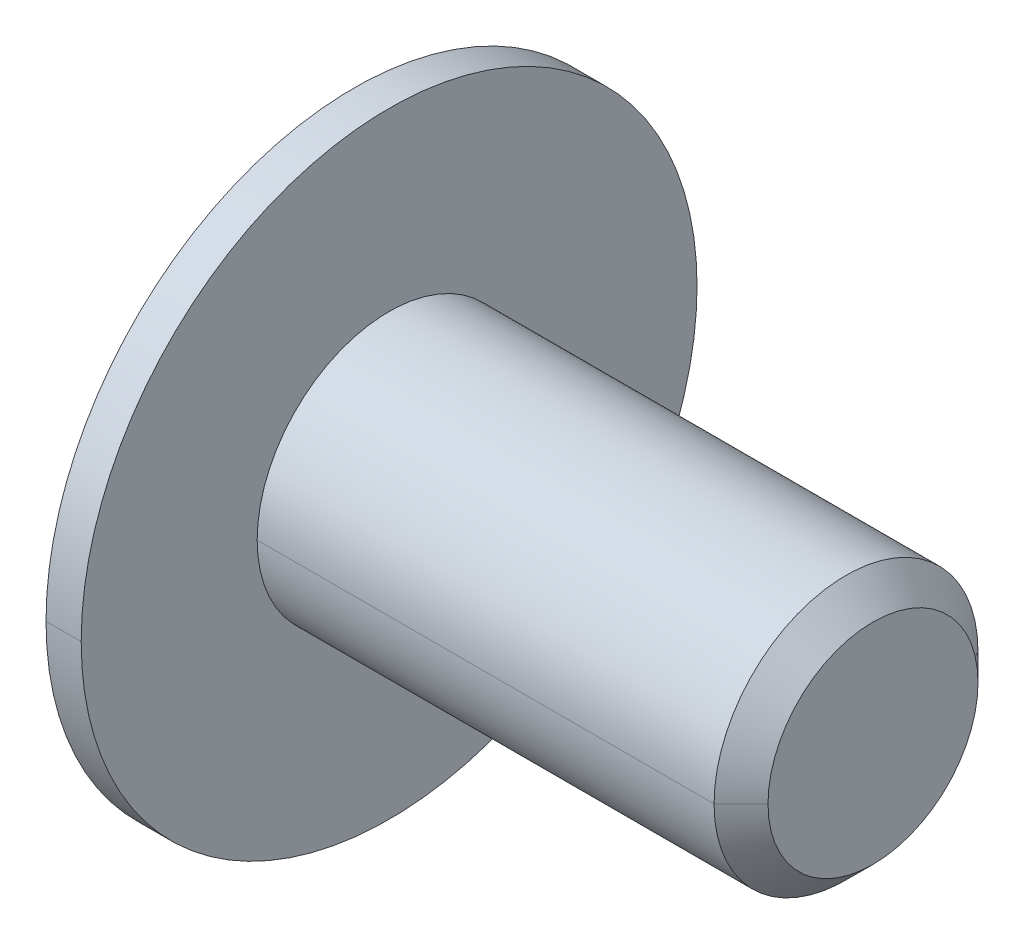
ISO-10303-21;
HEADER;
FILE_DESCRIPTION(('STEP AP214'),'2;1');
FILE_NAME('part.step','',(''),(''),'','','');
FILE_SCHEMA(('AUTOMOTIVE_DESIGN { 1 0 10303 214 1 1 1 1 }'));
ENDSEC;
DATA;
#1=APPLICATION_CONTEXT('core data for automotive mechanical design processes');
#2=APPLICATION_PROTOCOL_DEFINITION('international standard','automotive_design',2000,#1);
#3=PRODUCT_CONTEXT('',#1,'mechanical');
#4=PRODUCT('Part','Part','',(#3));
#5=PRODUCT_RELATED_PRODUCT_CATEGORY('part','',(#4));
#6=PRODUCT_DEFINITION_FORMATION('','',#4);
#7=PRODUCT_DEFINITION_CONTEXT('part definition',#1,'design');
#8=PRODUCT_DEFINITION('design','',#6,#7);
#9=PRODUCT_DEFINITION_SHAPE('','',#8);
#10=(LENGTH_UNIT() NAMED_UNIT(*) SI_UNIT(.MILLI.,.METRE.));
#11=(NAMED_UNIT(*) PLANE_ANGLE_UNIT() SI_UNIT($,.RADIAN.));
#12=(NAMED_UNIT(*) SI_UNIT($,.STERADIAN.) SOLID_ANGLE_UNIT());
#13=UNCERTAINTY_MEASURE_WITH_UNIT(LENGTH_MEASURE(1.E-05),#10,'distance_accuracy_value','');
#14=(GEOMETRIC_REPRESENTATION_CONTEXT(3) GLOBAL_UNCERTAINTY_ASSIGNED_CONTEXT((#13)) GLOBAL_UNIT_ASSIGNED_CONTEXT((#10,
#11,#12)) REPRESENTATION_CONTEXT('',''));
#15=CARTESIAN_POINT('',(0.,0.,0.));
#16=DIRECTION('',(0.,0.,1.));
#17=DIRECTION('',(1.,0.,0.));
#18=AXIS2_PLACEMENT_3D('',#15,#16,#17);
#19=CARTESIAN_POINT('',(-0.05,0.721070929376451,0.753098152207589));
#20=DIRECTION('',(1.,0.,0.));
#21=DIRECTION('',(0.,1.,0.));
#22=AXIS2_PLACEMENT_3D('',#19,#20,#21);
#23=PLANE('',#22);
#24=CARTESIAN_POINT('',(-0.05,0.583333333333333,1.01036297108185));
#25=DIRECTION('',(1.,0.,0.));
#26=DIRECTION('',(0.,0.,-1.));
#27=AXIS2_PLACEMENT_3D('',#24,#25,#26);
#28=CIRCLE('',#27,0.4117647059);
#29=CARTESIAN_POINT('',(-0.05,0.173596498582184,0.969547541909899));
#30=VERTEX_POINT('',#29);
#31=CARTESIAN_POINT('',(-0.05,0.752854552179633,0.635112748735148));
#32=VERTEX_POINT('',#31);
#33=EDGE_CURVE('E352',#30,#32,#28,.T.);
#34=ORIENTED_EDGE('',*,*,#33,.T.);
#35=CARTESIAN_POINT('',(-0.05,0.858808525419568,0.495833333333334));
#36=DIRECTION('',(1.,0.,0.));
#37=DIRECTION('',(0.,0.,-1.));
#38=AXIS2_PLACEMENT_3D('',#35,#36,#37);
#39=CIRCLE('',#38,0.175);
#40=CARTESIAN_POINT('',(-0.05,0.858808525419568,0.670833333333334));
#41=VERTEX_POINT('',#40);
#42=EDGE_CURVE('E333',#41,#32,#39,.T.);
#43=ORIENTED_EDGE('',*,*,#42,.F.);
#44=CARTESIAN_POINT('',(-0.05,0.858808525419568,0.495833333333334));
#45=DIRECTION('',(1.,0.,0.));
#46=DIRECTION('',(0.,0.,-1.));
#47=AXIS2_PLACEMENT_3D('',#44,#45,#46);
#48=CIRCLE('',#47,0.175);
#49=CARTESIAN_POINT('',(-0.05,0.926451050761822,0.334434793174749));
#50=VERTEX_POINT('',#49);
#51=EDGE_CURVE('E262',#50,#41,#48,.T.);
#52=ORIENTED_EDGE('',*,*,#51,.F.);
#53=CARTESIAN_POINT('',(-0.05,1.16666666666667,0.));
#54=DIRECTION('',(1.,0.,0.));
#55=DIRECTION('',(0.,0.,-1.));
#56=AXIS2_PLACEMENT_3D('',#53,#54,#55);
#57=CIRCLE('',#56,0.4117647059);
#58=CARTESIAN_POINT('',(-0.05,0.926451050761818,-0.334434793174745));
#59=VERTEX_POINT('',#58);
#60=EDGE_CURVE('E312',#50,#59,#57,.T.);
#61=ORIENTED_EDGE('',*,*,#60,.T.);
#62=CARTESIAN_POINT('',(-0.05,0.858808525419569,-0.495833333333333));
#63=DIRECTION('',(1.,0.,0.));
#64=DIRECTION('',(0.,0.,-1.));
#65=AXIS2_PLACEMENT_3D('',#62,#63,#64);
#66=CIRCLE('',#65,0.175);
#67=CARTESIAN_POINT('',(-0.05,0.75285455217964,-0.635112748735152));
#68=VERTEX_POINT('',#67);
#69=EDGE_CURVE('E316',#68,#59,#66,.T.);
#70=ORIENTED_EDGE('',*,*,#69,.F.);
#71=CARTESIAN_POINT('',(-0.05,0.583333333333333,-1.01036297108185));
#72=DIRECTION('',(1.,0.,0.));
#73=DIRECTION('',(0.,0.,-1.));
#74=AXIS2_PLACEMENT_3D('',#71,#72,#73);
#75=CIRCLE('',#74,0.4117647059);
#76=CARTESIAN_POINT('',(-0.05,0.583333333333333,-0.59859826518185));
#77=VERTEX_POINT('',#76);
#78=EDGE_CURVE('E244',#68,#77,#75,.T.);
#79=ORIENTED_EDGE('',*,*,#78,.T.);
#80=CARTESIAN_POINT('',(-0.05,0.583333333333333,-1.01036297108185));
#81=DIRECTION('',(1.,0.,0.));
#82=DIRECTION('',(0.,0.,-1.));
#83=AXIS2_PLACEMENT_3D('',#80,#81,#82);
#84=CIRCLE('',#83,0.4117647059);
#85=CARTESIAN_POINT('',(-0.05,0.173596498582185,-0.969547541909895));
#86=VERTEX_POINT('',#85);
#87=EDGE_CURVE('E278',#77,#86,#84,.T.);
#88=ORIENTED_EDGE('',*,*,#87,.T.);
#89=CARTESIAN_POINT('',(-0.05,0.,-0.991666666666667));
#90=DIRECTION('',(1.,0.,0.));
#91=DIRECTION('',(0.,0.,-1.));
#92=AXIS2_PLACEMENT_3D('',#89,#90,#91);
#93=CIRCLE('',#92,0.175);
#94=CARTESIAN_POINT('',(-0.05,-0.173596498582185,-0.969547541909899));
#95=VERTEX_POINT('',#94);
#96=EDGE_CURVE('E282',#95,#86,#93,.T.);
#97=ORIENTED_EDGE('',*,*,#96,.F.);
#98=CARTESIAN_POINT('',(-0.05,-0.583333333333334,-1.01036297108185));
#99=DIRECTION('',(1.,0.,0.));
#100=DIRECTION('',(0.,0.,-1.));
#101=AXIS2_PLACEMENT_3D('',#98,#99,#100);
#102=CIRCLE('',#101,0.4117647059);
#103=CARTESIAN_POINT('',(-0.05,-0.583333333333334,-0.59859826518185));
#104=VERTEX_POINT('',#103);
#105=EDGE_CURVE('E299',#95,#104,#102,.T.);
#106=ORIENTED_EDGE('',*,*,#105,.T.);
#107=CARTESIAN_POINT('',(-0.05,-0.583333333333334,-1.01036297108185));
#108=DIRECTION('',(1.,0.,0.));
#109=DIRECTION('',(0.,0.,-1.));
#110=AXIS2_PLACEMENT_3D('',#107,#108,#109);
#111=CIRCLE('',#110,0.4117647059);
#112=CARTESIAN_POINT('',(-0.05,-0.752854552179634,-0.635112748735148));
#113=VERTEX_POINT('',#112);
#114=EDGE_CURVE('E319',#104,#113,#111,.T.);
#115=ORIENTED_EDGE('',*,*,#114,.T.);
#116=CARTESIAN_POINT('',(-0.05,-0.858808525419567,-0.495833333333333));
#117=DIRECTION('',(1.,0.,0.));
#118=DIRECTION('',(0.,0.,-1.));
#119=AXIS2_PLACEMENT_3D('',#116,#117,#118);
#120=CIRCLE('',#119,0.175);
#121=CARTESIAN_POINT('',(-0.05,-0.926451050761821,-0.334434793174747));
#122=VERTEX_POINT('',#121);
#123=EDGE_CURVE('E372',#122,#113,#120,.T.);
#124=ORIENTED_EDGE('',*,*,#123,.F.);
#125=CARTESIAN_POINT('',(-0.05,-1.16666666666667,0.));
#126=DIRECTION('',(1.,0.,0.));
#127=DIRECTION('',(0.,0.,-1.));
#128=AXIS2_PLACEMENT_3D('',#125,#126,#127);
#129=CIRCLE('',#128,0.4117647059);
#130=CARTESIAN_POINT('',(-0.05,-0.926451050761819,0.334434793174746));
#131=VERTEX_POINT('',#130);
#132=EDGE_CURVE('E288',#122,#131,#129,.T.);
#133=ORIENTED_EDGE('',*,*,#132,.T.);
#134=CARTESIAN_POINT('',(-0.05,-0.858808525419569,0.495833333333333));
#135=DIRECTION('',(1.,0.,0.));
#136=DIRECTION('',(0.,0.,-1.));
#137=AXIS2_PLACEMENT_3D('',#134,#135,#136);
#138=CIRCLE('',#137,0.175);
#139=CARTESIAN_POINT('',(-0.05,-0.858808525419569,0.670833333333333));
#140=VERTEX_POINT('',#139);
#141=EDGE_CURVE('E272',#140,#131,#138,.T.);
#142=ORIENTED_EDGE('',*,*,#141,.F.);
#143=CARTESIAN_POINT('',(-0.05,-0.858808525419569,0.495833333333333));
#144=DIRECTION('',(1.,0.,0.));
#145=DIRECTION('',(0.,0.,-1.));
#146=AXIS2_PLACEMENT_3D('',#143,#144,#145);
#147=CIRCLE('',#146,0.175);
#148=CARTESIAN_POINT('',(-0.05,-0.752854552179638,0.63511274873515));
#149=VERTEX_POINT('',#148);
#150=EDGE_CURVE('E287',#149,#140,#147,.T.);
#151=ORIENTED_EDGE('',*,*,#150,.F.);
#152=CARTESIAN_POINT('',(-0.05,-0.583333333333333,1.01036297108185));
#153=DIRECTION('',(1.,0.,0.));
#154=DIRECTION('',(0.,0.,-1.));
#155=AXIS2_PLACEMENT_3D('',#152,#153,#154);
#156=CIRCLE('',#155,0.4117647059);
#157=CARTESIAN_POINT('',(-0.05,-0.173596498582185,0.969547541909894));
#158=VERTEX_POINT('',#157);
#159=EDGE_CURVE('E27',#149,#158,#156,.T.);
#160=ORIENTED_EDGE('',*,*,#159,.T.);
#161=CARTESIAN_POINT('',(-0.05,0.,0.991666666666667));
#162=DIRECTION('',(1.,0.,0.));
#163=DIRECTION('',(0.,0.,-1.));
#164=AXIS2_PLACEMENT_3D('',#161,#162,#163);
#165=CIRCLE('',#164,0.175);
#166=CARTESIAN_POINT('',(-0.05,0.,1.16666666666667));
#167=VERTEX_POINT('',#166);
#168=EDGE_CURVE('E293',#167,#158,#165,.T.);
#169=ORIENTED_EDGE('',*,*,#168,.F.);
#170=CARTESIAN_POINT('',(-0.05,0.,0.991666666666667));
#171=DIRECTION('',(1.,0.,0.));
#172=DIRECTION('',(0.,0.,-1.));
#173=AXIS2_PLACEMENT_3D('',#170,#171,#172);
#174=CIRCLE('',#173,0.175);
#175=EDGE_CURVE('E10',#30,#167,#174,.T.);
#176=ORIENTED_EDGE('',*,*,#175,.F.);
#177=EDGE_LOOP('',(#34,#43,#52,#61,#70,#79,#88,#97,#106,#115,#124,#133,#142,#151,#160,#169,#176));
#178=FACE_BOUND('',#177,.T.);
#179=ADVANCED_FACE('F16',(#178),#23,.F.);
#180=CARTESIAN_POINT('',(-0.05,0.,0.991666666666667));
#181=DIRECTION('',(1.,0.,0.));
#182=DIRECTION('',(0.,0.,1.));
#183=AXIS2_PLACEMENT_3D('',#180,#181,#182);
#184=CYLINDRICAL_SURFACE('',#183,0.175);
#185=DIRECTION('',(1.,0.,0.));
#186=VECTOR('',#185,1.);
#187=CARTESIAN_POINT('',(-0.05,0.,1.16666666666667));
#188=LINE('',#187,#186);
#189=CARTESIAN_POINT('',(-0.8,0.,1.16666666666667));
#190=VERTEX_POINT('',#189);
#191=EDGE_CURVE('E289',#190,#167,#188,.T.);
#192=ORIENTED_EDGE('',*,*,#191,.F.);
#193=CARTESIAN_POINT('',(-0.8,0.,0.991666666666667));
#194=DIRECTION('',(1.,0.,0.));
#195=DIRECTION('',(0.,0.,-1.));
#196=AXIS2_PLACEMENT_3D('',#193,#194,#195);
#197=CIRCLE('',#196,0.175);
#198=CARTESIAN_POINT('',(-0.8,0.173596498582184,0.969547541909899));
#199=VERTEX_POINT('',#198);
#200=EDGE_CURVE('E257',#199,#190,#197,.T.);
#201=ORIENTED_EDGE('',*,*,#200,.F.);
#202=DIRECTION('',(-1.,0.,0.));
#203=VECTOR('',#202,1.);
#204=CARTESIAN_POINT('',(-0.05,0.173596498582184,0.969547541909899));
#205=LINE('',#204,#203);
#206=EDGE_CURVE('E349',#30,#199,#205,.T.);
#207=ORIENTED_EDGE('',*,*,#206,.F.);
#208=ORIENTED_EDGE('',*,*,#175,.T.);
#209=EDGE_LOOP('',(#192,#201,#207,#208));
#210=FACE_BOUND('',#209,.T.);
#211=ADVANCED_FACE('F732',(#210),#184,.F.);
#212=CARTESIAN_POINT('',(-0.05,-0.583333333333333,1.01036297108185));
#213=DIRECTION('',(1.,0.,0.));
#214=DIRECTION('',(0.,0.,1.));
#215=AXIS2_PLACEMENT_3D('',#212,#213,#214);
#216=CYLINDRICAL_SURFACE('',#215,0.4117647059);
#217=CARTESIAN_POINT('',(-0.8,-0.583333333333333,1.01036297108185));
#218=DIRECTION('',(1.,0.,0.));
#219=DIRECTION('',(0.,0.,-1.));
#220=AXIS2_PLACEMENT_3D('',#217,#218,#219);
#221=CIRCLE('',#220,0.4117647059);
#222=CARTESIAN_POINT('',(-0.8,-0.752854552179638,0.63511274873515));
#223=VERTEX_POINT('',#222);
#224=CARTESIAN_POINT('',(-0.8,-0.173596498582185,0.969547541909894));
#225=VERTEX_POINT('',#224);
#226=EDGE_CURVE('E261',#223,#225,#221,.T.);
#227=ORIENTED_EDGE('',*,*,#226,.T.);
#228=DIRECTION('',(-1.,0.,0.));
#229=VECTOR('',#228,1.);
#230=CARTESIAN_POINT('',(-0.05,-0.173596498582185,0.969547541909894));
#231=LINE('',#230,#229);
#232=EDGE_CURVE('E311',#158,#225,#231,.T.);
#233=ORIENTED_EDGE('',*,*,#232,.F.);
#234=ORIENTED_EDGE('',*,*,#159,.F.);
#235=DIRECTION('',(-1.,0.,0.));
#236=VECTOR('',#235,1.);
#237=CARTESIAN_POINT('',(-0.05,-0.752854552179638,0.63511274873515));
#238=LINE('',#237,#236);
#239=EDGE_CURVE('E284',#149,#223,#238,.T.);
#240=ORIENTED_EDGE('',*,*,#239,.T.);
#241=EDGE_LOOP('',(#227,#233,#234,#240));
#242=FACE_BOUND('',#241,.T.);
#243=ADVANCED_FACE('F18',(#242),#216,.T.);
#244=CARTESIAN_POINT('',(-0.05,-0.858808525419569,0.495833333333333));
#245=DIRECTION('',(1.,0.,0.));
#246=DIRECTION('',(0.,0.,1.));
#247=AXIS2_PLACEMENT_3D('',#244,#245,#246);
#248=CYLINDRICAL_SURFACE('',#247,0.175);
#249=DIRECTION('',(1.,0.,0.));
#250=VECTOR('',#249,1.);
#251=CARTESIAN_POINT('',(-0.05,-0.858808525419569,0.670833333333333));
#252=LINE('',#251,#250);
#253=CARTESIAN_POINT('',(-0.8,-0.858808525419569,0.670833333333333));
#254=VERTEX_POINT('',#253);
#255=EDGE_CURVE('E356',#254,#140,#252,.T.);
#256=ORIENTED_EDGE('',*,*,#255,.F.);
#257=CARTESIAN_POINT('',(-0.8,-0.858808525419569,0.495833333333333));
#258=DIRECTION('',(1.,0.,0.));
#259=DIRECTION('',(0.,0.,-1.));
#260=AXIS2_PLACEMENT_3D('',#257,#258,#259);
#261=CIRCLE('',#260,0.175);
#262=EDGE_CURVE('E277',#223,#254,#261,.T.);
#263=ORIENTED_EDGE('',*,*,#262,.F.);
#264=ORIENTED_EDGE('',*,*,#239,.F.);
#265=ORIENTED_EDGE('',*,*,#150,.T.);
#266=EDGE_LOOP('',(#256,#263,#264,#265));
#267=FACE_BOUND('',#266,.T.);
#268=ADVANCED_FACE('F762',(#267),#248,.F.);
#269=CARTESIAN_POINT('',(-0.05,-1.16666666666667,0.));
#270=DIRECTION('',(1.,0.,0.));
#271=DIRECTION('',(0.,0.,1.));
#272=AXIS2_PLACEMENT_3D('',#269,#270,#271);
#273=CYLINDRICAL_SURFACE('',#272,0.4117647059);
#274=CARTESIAN_POINT('',(-0.8,-1.16666666666667,0.));
#275=DIRECTION('',(1.,0.,0.));
#276=DIRECTION('',(0.,0.,-1.));
#277=AXIS2_PLACEMENT_3D('',#274,#275,#276);
#278=CIRCLE('',#277,0.4117647059);
#279=CARTESIAN_POINT('',(-0.8,-0.926451050761821,-0.334434793174747));
#280=VERTEX_POINT('',#279);
#281=CARTESIAN_POINT('',(-0.8,-0.926451050761819,0.334434793174746));
#282=VERTEX_POINT('',#281);
#283=EDGE_CURVE('E273',#280,#282,#278,.T.);
#284=ORIENTED_EDGE('',*,*,#283,.T.);
#285=DIRECTION('',(-1.,0.,0.));
#286=VECTOR('',#285,1.);
#287=CARTESIAN_POINT('',(-0.05,-0.926451050761819,0.334434793174746));
#288=LINE('',#287,#286);
#289=EDGE_CURVE('E267',#131,#282,#288,.T.);
#290=ORIENTED_EDGE('',*,*,#289,.F.);
#291=ORIENTED_EDGE('',*,*,#132,.F.);
#292=DIRECTION('',(-1.,0.,0.));
#293=VECTOR('',#292,1.);
#294=CARTESIAN_POINT('',(-0.05,-0.926451050761821,-0.334434793174747));
#295=LINE('',#294,#293);
#296=EDGE_CURVE('E323',#122,#280,#295,.T.);
#297=ORIENTED_EDGE('',*,*,#296,.T.);
#298=EDGE_LOOP('',(#284,#290,#291,#297));
#299=FACE_BOUND('',#298,.T.);
#300=ADVANCED_FACE('F464',(#299),#273,.T.);
#301=CARTESIAN_POINT('',(-0.05,-0.858808525419567,-0.495833333333333));
#302=DIRECTION('',(1.,0.,0.));
#303=DIRECTION('',(0.,0.,1.));
#304=AXIS2_PLACEMENT_3D('',#301,#302,#303);
#305=CYLINDRICAL_SURFACE('',#304,0.175);
#306=CARTESIAN_POINT('',(-0.8,-0.858808525419567,-0.495833333333333));
#307=DIRECTION('',(1.,0.,0.));
#308=DIRECTION('',(0.,0.,-1.));
#309=AXIS2_PLACEMENT_3D('',#306,#307,#308);
#310=CIRCLE('',#309,0.175);
#311=CARTESIAN_POINT('',(-0.8,-0.752854552179634,-0.635112748735148));
#312=VERTEX_POINT('',#311);
#313=EDGE_CURVE('E276',#280,#312,#310,.T.);
#314=ORIENTED_EDGE('',*,*,#313,.F.);
#315=ORIENTED_EDGE('',*,*,#296,.F.);
#316=ORIENTED_EDGE('',*,*,#123,.T.);
#317=DIRECTION('',(-1.,0.,0.));
#318=VECTOR('',#317,1.);
#319=CARTESIAN_POINT('',(-0.05,-0.752854552179634,-0.635112748735148));
#320=LINE('',#319,#318);
#321=EDGE_CURVE('E20',#113,#312,#320,.T.);
#322=ORIENTED_EDGE('',*,*,#321,.T.);
#323=EDGE_LOOP('',(#314,#315,#316,#322));
#324=FACE_BOUND('',#323,.T.);
#325=ADVANCED_FACE('F451',(#324),#305,.F.);
#326=CARTESIAN_POINT('',(-0.05,-0.583333333333334,-1.01036297108185));
#327=DIRECTION('',(1.,0.,0.));
#328=DIRECTION('',(0.,0.,1.));
#329=AXIS2_PLACEMENT_3D('',#326,#327,#328);
#330=CYLINDRICAL_SURFACE('',#329,0.4117647059);
#331=DIRECTION('',(1.,0.,0.));
#332=VECTOR('',#331,1.);
#333=CARTESIAN_POINT('',(-0.05,-0.583333333333334,-0.59859826518185));
#334=LINE('',#333,#332);
#335=CARTESIAN_POINT('',(-0.8,-0.583333333333334,-0.59859826518185));
#336=VERTEX_POINT('',#335);
#337=EDGE_CURVE('E295',#336,#104,#334,.T.);
#338=ORIENTED_EDGE('',*,*,#337,.F.);
#339=CARTESIAN_POINT('',(-0.8,-0.583333333333334,-1.01036297108185));
#340=DIRECTION('',(1.,0.,0.));
#341=DIRECTION('',(0.,0.,-1.));
#342=AXIS2_PLACEMENT_3D('',#339,#340,#341);
#343=CIRCLE('',#342,0.4117647059);
#344=EDGE_CURVE('E337',#336,#312,#343,.T.);
#345=ORIENTED_EDGE('',*,*,#344,.T.);
#346=ORIENTED_EDGE('',*,*,#321,.F.);
#347=ORIENTED_EDGE('',*,*,#114,.F.);
#348=EDGE_LOOP('',(#338,#345,#346,#347));
#349=FACE_BOUND('',#348,.T.);
#350=ADVANCED_FACE('F458',(#349),#330,.T.);
#351=CARTESIAN_POINT('',(-0.05,0.,-0.991666666666667));
#352=DIRECTION('',(1.,0.,0.));
#353=DIRECTION('',(0.,0.,1.));
#354=AXIS2_PLACEMENT_3D('',#351,#352,#353);
#355=CYLINDRICAL_SURFACE('',#354,0.175);
#356=CARTESIAN_POINT('',(-0.8,0.,-0.991666666666667));
#357=DIRECTION('',(1.,0.,0.));
#358=DIRECTION('',(0.,0.,-1.));
#359=AXIS2_PLACEMENT_3D('',#356,#357,#358);
#360=CIRCLE('',#359,0.175);
#361=CARTESIAN_POINT('',(-0.8,-0.173596498582185,-0.969547541909899));
#362=VERTEX_POINT('',#361);
#363=CARTESIAN_POINT('',(-0.8,0.173596498582185,-0.969547541909895));
#364=VERTEX_POINT('',#363);
#365=EDGE_CURVE('E340',#362,#364,#360,.T.);
#366=ORIENTED_EDGE('',*,*,#365,.F.);
#367=DIRECTION('',(-1.,0.,0.));
#368=VECTOR('',#367,1.);
#369=CARTESIAN_POINT('',(-0.05,-0.173596498582185,-0.969547541909899));
#370=LINE('',#369,#368);
#371=EDGE_CURVE('E345',#95,#362,#370,.T.);
#372=ORIENTED_EDGE('',*,*,#371,.F.);
#373=ORIENTED_EDGE('',*,*,#96,.T.);
#374=DIRECTION('',(-1.,0.,0.));
#375=VECTOR('',#374,1.);
#376=CARTESIAN_POINT('',(-0.05,0.173596498582185,-0.969547541909895));
#377=LINE('',#376,#375);
#378=EDGE_CURVE('E283',#86,#364,#377,.T.);
#379=ORIENTED_EDGE('',*,*,#378,.T.);
#380=EDGE_LOOP('',(#366,#372,#373,#379));
#381=FACE_BOUND('',#380,.T.);
#382=ADVANCED_FACE('F503',(#381),#355,.F.);
#383=CARTESIAN_POINT('',(-0.05,0.583333333333333,-1.01036297108185));
#384=DIRECTION('',(1.,0.,0.));
#385=DIRECTION('',(0.,0.,1.));
#386=AXIS2_PLACEMENT_3D('',#383,#384,#385);
#387=CYLINDRICAL_SURFACE('',#386,0.4117647059);
#388=DIRECTION('',(1.,0.,0.));
#389=VECTOR('',#388,1.);
#390=CARTESIAN_POINT('',(-0.05,0.583333333333333,-0.59859826518185));
#391=LINE('',#390,#389);
#392=CARTESIAN_POINT('',(-0.8,0.583333333333333,-0.59859826518185));
#393=VERTEX_POINT('',#392);
#394=EDGE_CURVE('E300',#393,#77,#391,.T.);
#395=ORIENTED_EDGE('',*,*,#394,.F.);
#396=CARTESIAN_POINT('',(-0.8,0.583333333333333,-1.01036297108185));
#397=DIRECTION('',(1.,0.,0.));
#398=DIRECTION('',(0.,0.,-1.));
#399=AXIS2_PLACEMENT_3D('',#396,#397,#398);
#400=CIRCLE('',#399,0.4117647059);
#401=EDGE_CURVE('E344',#393,#364,#400,.T.);
#402=ORIENTED_EDGE('',*,*,#401,.T.);
#403=ORIENTED_EDGE('',*,*,#378,.F.);
#404=ORIENTED_EDGE('',*,*,#87,.F.);
#405=EDGE_LOOP('',(#395,#402,#403,#404));
#406=FACE_BOUND('',#405,.T.);
#407=ADVANCED_FACE('F502',(#406),#387,.T.);
#408=CARTESIAN_POINT('',(-0.05,0.858808525419569,-0.495833333333333));
#409=DIRECTION('',(1.,0.,0.));
#410=DIRECTION('',(0.,0.,1.));
#411=AXIS2_PLACEMENT_3D('',#408,#409,#410);
#412=CYLINDRICAL_SURFACE('',#411,0.175);
#413=CARTESIAN_POINT('',(-0.8,0.858808525419569,-0.495833333333333));
#414=DIRECTION('',(1.,0.,0.));
#415=DIRECTION('',(0.,0.,-1.));
#416=AXIS2_PLACEMENT_3D('',#413,#414,#415);
#417=CIRCLE('',#416,0.175);
#418=CARTESIAN_POINT('',(-0.8,0.75285455217964,-0.635112748735152));
#419=VERTEX_POINT('',#418);
#420=CARTESIAN_POINT('',(-0.8,0.926451050761818,-0.334434793174745));
#421=VERTEX_POINT('',#420);
#422=EDGE_CURVE('E399',#419,#421,#417,.T.);
#423=ORIENTED_EDGE('',*,*,#422,.F.);
#424=DIRECTION('',(-1.,0.,0.));
#425=VECTOR('',#424,1.);
#426=CARTESIAN_POINT('',(-0.05,0.75285455217964,-0.635112748735152));
#427=LINE('',#426,#425);
#428=EDGE_CURVE('E235',#68,#419,#427,.T.);
#429=ORIENTED_EDGE('',*,*,#428,.F.);
#430=ORIENTED_EDGE('',*,*,#69,.T.);
#431=DIRECTION('',(-1.,0.,0.));
#432=VECTOR('',#431,1.);
#433=CARTESIAN_POINT('',(-0.05,0.926451050761818,-0.334434793174745));
#434=LINE('',#433,#432);
#435=EDGE_CURVE('E175',#59,#421,#434,.T.);
#436=ORIENTED_EDGE('',*,*,#435,.T.);
#437=EDGE_LOOP('',(#423,#429,#430,#436));
#438=FACE_BOUND('',#437,.T.);
#439=ADVANCED_FACE('F484',(#438),#412,.F.);
#440=CARTESIAN_POINT('',(-0.05,1.16666666666667,0.));
#441=DIRECTION('',(1.,0.,0.));
#442=DIRECTION('',(0.,0.,1.));
#443=AXIS2_PLACEMENT_3D('',#440,#441,#442);
#444=CYLINDRICAL_SURFACE('',#443,0.4117647059);
#445=DIRECTION('',(-1.,0.,0.));
#446=VECTOR('',#445,1.);
#447=CARTESIAN_POINT('',(-0.05,0.926451050761822,0.334434793174749));
#448=LINE('',#447,#446);
#449=CARTESIAN_POINT('',(-0.8,0.926451050761822,0.334434793174749));
#450=VERTEX_POINT('',#449);
#451=EDGE_CURVE('E266',#50,#450,#448,.T.);
#452=ORIENTED_EDGE('',*,*,#451,.T.);
#453=CARTESIAN_POINT('',(-0.8,1.16666666666667,0.));
#454=DIRECTION('',(-1.,0.,0.));
#455=DIRECTION('',(0.,0.,-1.));
#456=AXIS2_PLACEMENT_3D('',#453,#454,#455);
#457=CIRCLE('',#456,0.4117647059);
#458=EDGE_CURVE('E395',#421,#450,#457,.T.);
#459=ORIENTED_EDGE('',*,*,#458,.F.);
#460=ORIENTED_EDGE('',*,*,#435,.F.);
#461=ORIENTED_EDGE('',*,*,#60,.F.);
#462=EDGE_LOOP('',(#452,#459,#460,#461));
#463=FACE_BOUND('',#462,.T.);
#464=ADVANCED_FACE('F490',(#463),#444,.T.);
#465=CARTESIAN_POINT('',(-0.8,0.,0.));
#466=DIRECTION('',(1.,0.,0.));
#467=DIRECTION('',(0.,0.,-1.));
#468=AXIS2_PLACEMENT_3D('',#465,#466,#467);
#469=CONICAL_SURFACE('',#468,2.8,1.0516502125);
#470=DIRECTION('',(0.496138938398834,0.,0.868243142100459));
#471=VECTOR('',#470,1.);
#472=CARTESIAN_POINT('',(-0.8,0.,2.8));
#473=LINE('',#472,#471);
#474=CARTESIAN_POINT('',(-0.8,0.,2.8));
#475=VERTEX_POINT('',#474);
#476=CARTESIAN_POINT('',(-0.4,0.,3.5));
#477=VERTEX_POINT('',#476);
#478=EDGE_CURVE('E217',#475,#477,#473,.T.);
#479=ORIENTED_EDGE('',*,*,#478,.F.);
#480=CARTESIAN_POINT('',(-0.8,0.,0.));
#481=DIRECTION('',(1.,0.,0.));
#482=DIRECTION('',(0.,0.,-1.));
#483=AXIS2_PLACEMENT_3D('',#480,#481,#482);
#484=CIRCLE('',#483,2.8);
#485=CARTESIAN_POINT('',(-0.8,0.,-2.8));
#486=VERTEX_POINT('',#485);
#487=EDGE_CURVE('E210',#475,#486,#484,.T.);
#488=ORIENTED_EDGE('',*,*,#487,.T.);
#489=DIRECTION('',(0.496138938398834,0.,-0.868243142100459));
#490=VECTOR('',#489,1.);
#491=CARTESIAN_POINT('',(-0.8,0.,-2.8));
#492=LINE('',#491,#490);
#493=CARTESIAN_POINT('',(-0.4,0.,-3.5));
#494=VERTEX_POINT('',#493);
#495=EDGE_CURVE('E214',#486,#494,#492,.T.);
#496=ORIENTED_EDGE('',*,*,#495,.T.);
#497=CARTESIAN_POINT('',(-0.4,0.,0.));
#498=DIRECTION('',(1.,0.,0.));
#499=DIRECTION('',(0.,0.,-1.));
#500=AXIS2_PLACEMENT_3D('',#497,#498,#499);
#501=CIRCLE('',#500,3.5);
#502=EDGE_CURVE('E250',#477,#494,#501,.T.);
#503=ORIENTED_EDGE('',*,*,#502,.F.);
#504=EDGE_LOOP('',(#479,#488,#496,#503));
#505=FACE_BOUND('',#504,.T.);
#506=ADVANCED_FACE('F212',(#505),#469,.T.);
#507=CARTESIAN_POINT('',(6.,0.,0.));
#508=DIRECTION('',(-1.,0.,0.));
#509=DIRECTION('',(0.,0.,-1.));
#510=AXIS2_PLACEMENT_3D('',#507,#508,#509);
#511=CYLINDRICAL_SURFACE('',#510,3.5);
#512=DIRECTION('',(-1.,0.,0.));
#513=VECTOR('',#512,1.);
#514=CARTESIAN_POINT('',(6.,0.,3.5));
#515=LINE('',#514,#513);
#516=CARTESIAN_POINT('',(0.,0.,3.5));
#517=VERTEX_POINT('',#516);
#518=EDGE_CURVE('E254',#517,#477,#515,.T.);
#519=ORIENTED_EDGE('',*,*,#518,.F.);
#520=CARTESIAN_POINT('',(0.,0.,0.));
#521=DIRECTION('',(1.,0.,0.));
#522=DIRECTION('',(0.,0.,-1.));
#523=AXIS2_PLACEMENT_3D('',#520,#521,#522);
#524=CIRCLE('',#523,3.5);
#525=CARTESIAN_POINT('',(0.,0.,-3.5));
#526=VERTEX_POINT('',#525);
#527=EDGE_CURVE('E388',#526,#517,#524,.T.);
#528=ORIENTED_EDGE('',*,*,#527,.F.);
#529=DIRECTION('',(-1.,0.,0.));
#530=VECTOR('',#529,1.);
#531=CARTESIAN_POINT('',(6.,0.,-3.5));
#532=LINE('',#531,#530);
#533=EDGE_CURVE('E247',#526,#494,#532,.T.);
#534=ORIENTED_EDGE('',*,*,#533,.T.);
#535=CARTESIAN_POINT('',(-0.4,0.,0.));
#536=DIRECTION('',(1.,0.,0.));
#537=DIRECTION('',(0.,0.,-1.));
#538=AXIS2_PLACEMENT_3D('',#535,#536,#537);
#539=CIRCLE('',#538,3.5);
#540=EDGE_CURVE('E229',#494,#477,#539,.T.);
#541=ORIENTED_EDGE('',*,*,#540,.T.);
#542=EDGE_LOOP('',(#519,#528,#534,#541));
#543=FACE_BOUND('',#542,.T.);
#544=ADVANCED_FACE('F748',(#543),#511,.T.);
#545=CARTESIAN_POINT('',(0.,3.5,0.));
#546=DIRECTION('',(-1.,0.,0.));
#547=DIRECTION('',(0.,0.,1.));
#548=AXIS2_PLACEMENT_3D('',#545,#546,#547);
#549=PLANE('',#548);
#550=CARTESIAN_POINT('',(0.,0.,0.));
#551=DIRECTION('',(1.,0.,0.));
#552=DIRECTION('',(0.,0.,-1.));
#553=AXIS2_PLACEMENT_3D('',#550,#551,#552);
#554=CIRCLE('',#553,1.5);
#555=CARTESIAN_POINT('',(0.,0.,-1.5));
#556=VERTEX_POINT('',#555);
#557=CARTESIAN_POINT('',(0.,0.,1.5));
#558=VERTEX_POINT('',#557);
#559=EDGE_CURVE('E391',#556,#558,#554,.T.);
#560=ORIENTED_EDGE('',*,*,#559,.F.);
#561=CARTESIAN_POINT('',(0.,0.,0.));
#562=DIRECTION('',(1.,0.,0.));
#563=DIRECTION('',(0.,0.,-1.));
#564=AXIS2_PLACEMENT_3D('',#561,#562,#563);
#565=CIRCLE('',#564,1.5);
#566=EDGE_CURVE('E363',#558,#556,#565,.T.);
#567=ORIENTED_EDGE('',*,*,#566,.F.);
#568=EDGE_LOOP('',(#560,#567));
#569=FACE_BOUND('',#568,.T.);
#570=ORIENTED_EDGE('',*,*,#527,.T.);
#571=CARTESIAN_POINT('',(0.,0.,0.));
#572=DIRECTION('',(1.,0.,0.));
#573=DIRECTION('',(0.,0.,-1.));
#574=AXIS2_PLACEMENT_3D('',#571,#572,#573);
#575=CIRCLE('',#574,3.5);
#576=EDGE_CURVE('E231',#517,#526,#575,.T.);
#577=ORIENTED_EDGE('',*,*,#576,.T.);
#578=EDGE_LOOP('',(#570,#577));
#579=FACE_BOUND('',#578,.T.);
#580=ADVANCED_FACE('F696',(#569,#579),#549,.F.);
#581=CARTESIAN_POINT('',(6.,0.,0.));
#582=DIRECTION('',(-1.,0.,0.));
#583=DIRECTION('',(0.,0.,-1.));
#584=AXIS2_PLACEMENT_3D('',#581,#582,#583);
#585=CYLINDRICAL_SURFACE('',#584,1.5);
#586=DIRECTION('',(-1.,0.,0.));
#587=VECTOR('',#586,1.);
#588=CARTESIAN_POINT('',(6.,0.,1.5));
#589=LINE('',#588,#587);
#590=CARTESIAN_POINT('',(5.1935,0.,1.5));
#591=VERTEX_POINT('',#590);
#592=EDGE_CURVE('E368',#591,#558,#589,.T.);
#593=ORIENTED_EDGE('',*,*,#592,.F.);
#594=CARTESIAN_POINT('',(5.1935,0.,0.));
#595=DIRECTION('',(1.,0.,0.));
#596=DIRECTION('',(0.,0.,-1.));
#597=AXIS2_PLACEMENT_3D('',#594,#595,#596);
#598=CIRCLE('',#597,1.5);
#599=CARTESIAN_POINT('',(5.1935,0.,-1.5));
#600=VERTEX_POINT('',#599);
#601=EDGE_CURVE('E358',#600,#591,#598,.T.);
#602=ORIENTED_EDGE('',*,*,#601,.F.);
#603=DIRECTION('',(-1.,0.,0.));
#604=VECTOR('',#603,1.);
#605=CARTESIAN_POINT('',(6.,0.,-1.5));
#606=LINE('',#605,#604);
#607=EDGE_CURVE('E367',#600,#556,#606,.T.);
#608=ORIENTED_EDGE('',*,*,#607,.T.);
#609=ORIENTED_EDGE('',*,*,#559,.T.);
#610=EDGE_LOOP('',(#593,#602,#608,#609));
#611=FACE_BOUND('',#610,.T.);
#612=ADVANCED_FACE('F689',(#611),#585,.T.);
#613=CARTESIAN_POINT('',(5.1935,0.,0.));
#614=DIRECTION('',(-1.,0.,0.));
#615=DIRECTION('',(0.,0.,1.));
#616=AXIS2_PLACEMENT_3D('',#613,#614,#615);
#617=CONICAL_SURFACE('',#616,1.5,0.7853981634);
#618=DIRECTION('',(-0.707106781184743,0.,-0.707106781188352));
#619=VECTOR('',#618,1.);
#620=CARTESIAN_POINT('',(5.1935,0.,-1.5));
#621=LINE('',#620,#619);
#622=CARTESIAN_POINT('',(5.5,0.,-1.1935));
#623=VERTEX_POINT('',#622);
#624=EDGE_CURVE('E362',#623,#600,#621,.T.);
#625=ORIENTED_EDGE('',*,*,#624,.F.);
#626=CARTESIAN_POINT('',(5.5,0.,0.));
#627=DIRECTION('',(1.,0.,0.));
#628=DIRECTION('',(0.,0.,-1.));
#629=AXIS2_PLACEMENT_3D('',#626,#627,#628);
#630=CIRCLE('',#629,1.1935);
#631=CARTESIAN_POINT('',(5.5,0.,1.1935));
#632=VERTEX_POINT('',#631);
#633=EDGE_CURVE('E265',#632,#623,#630,.T.);
#634=ORIENTED_EDGE('',*,*,#633,.F.);
#635=DIRECTION('',(-0.707106781184743,0.,0.707106781188352));
#636=VECTOR('',#635,1.);
#637=CARTESIAN_POINT('',(5.1935,0.,1.5));
#638=LINE('',#637,#636);
#639=EDGE_CURVE('E329',#632,#591,#638,.T.);
#640=ORIENTED_EDGE('',*,*,#639,.T.);
#641=CARTESIAN_POINT('',(5.1935,0.,0.));
#642=DIRECTION('',(1.,0.,0.));
#643=DIRECTION('',(0.,0.,-1.));
#644=AXIS2_PLACEMENT_3D('',#641,#642,#643);
#645=CIRCLE('',#644,1.5);
#646=EDGE_CURVE('E402',#591,#600,#645,.T.);
#647=ORIENTED_EDGE('',*,*,#646,.T.);
#648=EDGE_LOOP('',(#625,#634,#640,#647));
#649=FACE_BOUND('',#648,.T.);
#650=ADVANCED_FACE('F676',(#649),#617,.T.);
#651=CARTESIAN_POINT('',(5.5,1.1935,0.));
#652=DIRECTION('',(-1.,0.,0.));
#653=DIRECTION('',(0.,0.,1.));
#654=AXIS2_PLACEMENT_3D('',#651,#652,#653);
#655=PLANE('',#654);
#656=ORIENTED_EDGE('',*,*,#633,.T.);
#657=CARTESIAN_POINT('',(5.5,0.,0.));
#658=DIRECTION('',(1.,0.,0.));
#659=DIRECTION('',(0.,0.,-1.));
#660=AXIS2_PLACEMENT_3D('',#657,#658,#659);
#661=CIRCLE('',#660,1.1935);
#662=EDGE_CURVE('E425',#623,#632,#661,.T.);
#663=ORIENTED_EDGE('',*,*,#662,.T.);
#664=EDGE_LOOP('',(#656,#663));
#665=FACE_BOUND('',#664,.T.);
#666=ADVANCED_FACE('F716',(#665),#655,.F.);
#667=CARTESIAN_POINT('',(-0.05,0.858808525419568,0.495833333333334));
#668=DIRECTION('',(1.,0.,0.));
#669=DIRECTION('',(0.,0.,1.));
#670=AXIS2_PLACEMENT_3D('',#667,#668,#669);
#671=CYLINDRICAL_SURFACE('',#670,0.175);
#672=DIRECTION('',(1.,0.,0.));
#673=VECTOR('',#672,1.);
#674=CARTESIAN_POINT('',(-0.05,0.858808525419568,0.670833333333334));
#675=LINE('',#674,#673);
#676=CARTESIAN_POINT('',(-0.8,0.858808525419568,0.670833333333334));
#677=VERTEX_POINT('',#676);
#678=EDGE_CURVE('E328',#677,#41,#675,.T.);
#679=ORIENTED_EDGE('',*,*,#678,.F.);
#680=CARTESIAN_POINT('',(-0.8,0.858808525419568,0.495833333333334));
#681=DIRECTION('',(1.,0.,0.));
#682=DIRECTION('',(0.,0.,-1.));
#683=AXIS2_PLACEMENT_3D('',#680,#681,#682);
#684=CIRCLE('',#683,0.175);
#685=EDGE_CURVE('E222',#450,#677,#684,.T.);
#686=ORIENTED_EDGE('',*,*,#685,.F.);
#687=ORIENTED_EDGE('',*,*,#451,.F.);
#688=ORIENTED_EDGE('',*,*,#51,.T.);
#689=EDGE_LOOP('',(#679,#686,#687,#688));
#690=FACE_BOUND('',#689,.T.);
#691=ADVANCED_FACE('F718',(#690),#671,.F.);
#692=CARTESIAN_POINT('',(-0.05,0.583333333333333,1.01036297108185));
#693=DIRECTION('',(1.,0.,0.));
#694=DIRECTION('',(0.,0.,1.));
#695=AXIS2_PLACEMENT_3D('',#692,#693,#694);
#696=CYLINDRICAL_SURFACE('',#695,0.4117647059);
#697=CARTESIAN_POINT('',(-0.8,0.583333333333333,1.01036297108185));
#698=DIRECTION('',(1.,0.,0.));
#699=DIRECTION('',(0.,0.,-1.));
#700=AXIS2_PLACEMENT_3D('',#697,#698,#699);
#701=CIRCLE('',#700,0.4117647059);
#702=CARTESIAN_POINT('',(-0.8,0.752854552179633,0.635112748735148));
#703=VERTEX_POINT('',#702);
#704=EDGE_CURVE('E255',#199,#703,#701,.T.);
#705=ORIENTED_EDGE('',*,*,#704,.T.);
#706=DIRECTION('',(-1.,0.,0.));
#707=VECTOR('',#706,1.);
#708=CARTESIAN_POINT('',(-0.05,0.752854552179633,0.635112748735148));
#709=LINE('',#708,#707);
#710=EDGE_CURVE('E223',#32,#703,#709,.T.);
#711=ORIENTED_EDGE('',*,*,#710,.F.);
#712=ORIENTED_EDGE('',*,*,#33,.F.);
#713=ORIENTED_EDGE('',*,*,#206,.T.);
#714=EDGE_LOOP('',(#705,#711,#712,#713));
#715=FACE_BOUND('',#714,.T.);
#716=ADVANCED_FACE('F725',(#715),#696,.T.);
#717=CARTESIAN_POINT('',(-0.8,0.,0.));
#718=DIRECTION('',(1.,0.,0.));
#719=DIRECTION('',(0.,1.,0.));
#720=AXIS2_PLACEMENT_3D('',#717,#718,#719);
#721=PLANE('',#720);
#722=ORIENTED_EDGE('',*,*,#685,.T.);
#723=CARTESIAN_POINT('',(-0.8,0.858808525419568,0.495833333333334));
#724=DIRECTION('',(1.,0.,0.));
#725=DIRECTION('',(0.,0.,-1.));
#726=AXIS2_PLACEMENT_3D('',#723,#724,#725);
#727=CIRCLE('',#726,0.175);
#728=EDGE_CURVE('E324',#677,#703,#727,.T.);
#729=ORIENTED_EDGE('',*,*,#728,.T.);
#730=ORIENTED_EDGE('',*,*,#704,.F.);
#731=ORIENTED_EDGE('',*,*,#200,.T.);
#732=CARTESIAN_POINT('',(-0.8,0.,0.991666666666667));
#733=DIRECTION('',(1.,0.,0.));
#734=DIRECTION('',(0.,0.,-1.));
#735=AXIS2_PLACEMENT_3D('',#732,#733,#734);
#736=CIRCLE('',#735,0.175);
#737=EDGE_CURVE('E294',#190,#225,#736,.T.);
#738=ORIENTED_EDGE('',*,*,#737,.T.);
#739=ORIENTED_EDGE('',*,*,#226,.F.);
#740=ORIENTED_EDGE('',*,*,#262,.T.);
#741=CARTESIAN_POINT('',(-0.8,-0.858808525419569,0.495833333333333));
#742=DIRECTION('',(1.,0.,0.));
#743=DIRECTION('',(0.,0.,-1.));
#744=AXIS2_PLACEMENT_3D('',#741,#742,#743);
#745=CIRCLE('',#744,0.175);
#746=EDGE_CURVE('E353',#254,#282,#745,.T.);
#747=ORIENTED_EDGE('',*,*,#746,.T.);
#748=ORIENTED_EDGE('',*,*,#283,.F.);
#749=ORIENTED_EDGE('',*,*,#313,.T.);
#750=ORIENTED_EDGE('',*,*,#344,.F.);
#751=CARTESIAN_POINT('',(-0.8,-0.583333333333334,-1.01036297108185));
#752=DIRECTION('',(1.,0.,0.));
#753=DIRECTION('',(0.,0.,-1.));
#754=AXIS2_PLACEMENT_3D('',#751,#752,#753);
#755=CIRCLE('',#754,0.4117647059);
#756=EDGE_CURVE('E271',#362,#336,#755,.T.);
#757=ORIENTED_EDGE('',*,*,#756,.F.);
#758=ORIENTED_EDGE('',*,*,#365,.T.);
#759=ORIENTED_EDGE('',*,*,#401,.F.);
#760=CARTESIAN_POINT('',(-0.8,0.583333333333333,-1.01036297108185));
#761=DIRECTION('',(1.,0.,0.));
#762=DIRECTION('',(0.,0.,-1.));
#763=AXIS2_PLACEMENT_3D('',#760,#761,#762);
#764=CIRCLE('',#763,0.4117647059);
#765=EDGE_CURVE('E304',#419,#393,#764,.T.);
#766=ORIENTED_EDGE('',*,*,#765,.F.);
#767=ORIENTED_EDGE('',*,*,#422,.T.);
#768=ORIENTED_EDGE('',*,*,#458,.T.);
#769=EDGE_LOOP('',(#722,#729,#730,#731,#738,#739,#740,#747,#748,#749,#750,#757,#758,#759,#766,
#767,#768));
#770=FACE_BOUND('',#769,.T.);
#771=CARTESIAN_POINT('',(-0.8,0.,0.));
#772=DIRECTION('',(1.,0.,0.));
#773=DIRECTION('',(0.,0.,-1.));
#774=AXIS2_PLACEMENT_3D('',#771,#772,#773);
#775=CIRCLE('',#774,2.8);
#776=EDGE_CURVE('E227',#486,#475,#775,.T.);
#777=ORIENTED_EDGE('',*,*,#776,.F.);
#778=ORIENTED_EDGE('',*,*,#487,.F.);
#779=EDGE_LOOP('',(#777,#778));
#780=FACE_BOUND('',#779,.T.);
#781=ADVANCED_FACE('F233',(#770,#780),#721,.F.);
#782=CARTESIAN_POINT('',(-0.05,0.858808525419568,0.495833333333334));
#783=DIRECTION('',(1.,0.,0.));
#784=DIRECTION('',(0.,0.,1.));
#785=AXIS2_PLACEMENT_3D('',#782,#783,#784);
#786=CYLINDRICAL_SURFACE('',#785,0.175);
#787=ORIENTED_EDGE('',*,*,#728,.F.);
#788=ORIENTED_EDGE('',*,*,#678,.T.);
#789=ORIENTED_EDGE('',*,*,#42,.T.);
#790=ORIENTED_EDGE('',*,*,#710,.T.);
#791=EDGE_LOOP('',(#787,#788,#789,#790));
#792=FACE_BOUND('',#791,.T.);
#793=ADVANCED_FACE('F770',(#792),#786,.F.);
#794=CARTESIAN_POINT('',(5.1935,0.,0.));
#795=DIRECTION('',(-1.,0.,0.));
#796=DIRECTION('',(0.,0.,1.));
#797=AXIS2_PLACEMENT_3D('',#794,#795,#796);
#798=CONICAL_SURFACE('',#797,1.5,0.7853981634);
#799=ORIENTED_EDGE('',*,*,#662,.F.);
#800=ORIENTED_EDGE('',*,*,#624,.T.);
#801=ORIENTED_EDGE('',*,*,#601,.T.);
#802=ORIENTED_EDGE('',*,*,#639,.F.);
#803=EDGE_LOOP('',(#799,#800,#801,#802));
#804=FACE_BOUND('',#803,.T.);
#805=ADVANCED_FACE('F685',(#804),#798,.T.);
#806=CARTESIAN_POINT('',(6.,0.,0.));
#807=DIRECTION('',(-1.,0.,0.));
#808=DIRECTION('',(0.,0.,-1.));
#809=AXIS2_PLACEMENT_3D('',#806,#807,#808);
#810=CYLINDRICAL_SURFACE('',#809,1.5);
#811=ORIENTED_EDGE('',*,*,#646,.F.);
#812=ORIENTED_EDGE('',*,*,#592,.T.);
#813=ORIENTED_EDGE('',*,*,#566,.T.);
#814=ORIENTED_EDGE('',*,*,#607,.F.);
#815=EDGE_LOOP('',(#811,#812,#813,#814));
#816=FACE_BOUND('',#815,.T.);
#817=ADVANCED_FACE('F694',(#816),#810,.T.);
#818=CARTESIAN_POINT('',(6.,0.,0.));
#819=DIRECTION('',(-1.,0.,0.));
#820=DIRECTION('',(0.,0.,-1.));
#821=AXIS2_PLACEMENT_3D('',#818,#819,#820);
#822=CYLINDRICAL_SURFACE('',#821,3.5);
#823=ORIENTED_EDGE('',*,*,#576,.F.);
#824=ORIENTED_EDGE('',*,*,#518,.T.);
#825=ORIENTED_EDGE('',*,*,#502,.T.);
#826=ORIENTED_EDGE('',*,*,#533,.F.);
#827=EDGE_LOOP('',(#823,#824,#825,#826));
#828=FACE_BOUND('',#827,.T.);
#829=ADVANCED_FACE('F749',(#828),#822,.T.);
#830=CARTESIAN_POINT('',(-0.8,0.,0.));
#831=DIRECTION('',(1.,0.,0.));
#832=DIRECTION('',(0.,0.,-1.));
#833=AXIS2_PLACEMENT_3D('',#830,#831,#832);
#834=CONICAL_SURFACE('',#833,2.8,1.0516502125);
#835=ORIENTED_EDGE('',*,*,#776,.T.);
#836=ORIENTED_EDGE('',*,*,#478,.T.);
#837=ORIENTED_EDGE('',*,*,#540,.F.);
#838=ORIENTED_EDGE('',*,*,#495,.F.);
#839=EDGE_LOOP('',(#835,#836,#837,#838));
#840=FACE_BOUND('',#839,.T.);
#841=ADVANCED_FACE('F226',(#840),#834,.T.);
#842=CARTESIAN_POINT('',(-0.05,0.583333333333333,-1.01036297108185));
#843=DIRECTION('',(1.,0.,0.));
#844=DIRECTION('',(0.,0.,1.));
#845=AXIS2_PLACEMENT_3D('',#842,#843,#844);
#846=CYLINDRICAL_SURFACE('',#845,0.4117647059);
#847=ORIENTED_EDGE('',*,*,#765,.T.);
#848=ORIENTED_EDGE('',*,*,#394,.T.);
#849=ORIENTED_EDGE('',*,*,#78,.F.);
#850=ORIENTED_EDGE('',*,*,#428,.T.);
#851=EDGE_LOOP('',(#847,#848,#849,#850));
#852=FACE_BOUND('',#851,.T.);
#853=ADVANCED_FACE('F495',(#852),#846,.T.);
#854=CARTESIAN_POINT('',(-0.05,-0.583333333333334,-1.01036297108185));
#855=DIRECTION('',(1.,0.,0.));
#856=DIRECTION('',(0.,0.,1.));
#857=AXIS2_PLACEMENT_3D('',#854,#855,#856);
#858=CYLINDRICAL_SURFACE('',#857,0.4117647059);
#859=ORIENTED_EDGE('',*,*,#756,.T.);
#860=ORIENTED_EDGE('',*,*,#337,.T.);
#861=ORIENTED_EDGE('',*,*,#105,.F.);
#862=ORIENTED_EDGE('',*,*,#371,.T.);
#863=EDGE_LOOP('',(#859,#860,#861,#862));
#864=FACE_BOUND('',#863,.T.);
#865=ADVANCED_FACE('F506',(#864),#858,.T.);
#866=CARTESIAN_POINT('',(-0.05,-0.858808525419569,0.495833333333333));
#867=DIRECTION('',(1.,0.,0.));
#868=DIRECTION('',(0.,0.,1.));
#869=AXIS2_PLACEMENT_3D('',#866,#867,#868);
#870=CYLINDRICAL_SURFACE('',#869,0.175);
#871=ORIENTED_EDGE('',*,*,#746,.F.);
#872=ORIENTED_EDGE('',*,*,#255,.T.);
#873=ORIENTED_EDGE('',*,*,#141,.T.);
#874=ORIENTED_EDGE('',*,*,#289,.T.);
#875=EDGE_LOOP('',(#871,#872,#873,#874));
#876=FACE_BOUND('',#875,.T.);
#877=ADVANCED_FACE('F466',(#876),#870,.F.);
#878=CARTESIAN_POINT('',(-0.05,0.,0.991666666666667));
#879=DIRECTION('',(1.,0.,0.));
#880=DIRECTION('',(0.,0.,1.));
#881=AXIS2_PLACEMENT_3D('',#878,#879,#880);
#882=CYLINDRICAL_SURFACE('',#881,0.175);
#883=ORIENTED_EDGE('',*,*,#737,.F.);
#884=ORIENTED_EDGE('',*,*,#191,.T.);
#885=ORIENTED_EDGE('',*,*,#168,.T.);
#886=ORIENTED_EDGE('',*,*,#232,.T.);
#887=EDGE_LOOP('',(#883,#884,#885,#886));
#888=FACE_BOUND('',#887,.T.);
#889=ADVANCED_FACE('F1009',(#888),#882,.F.);
#890=CLOSED_SHELL('',(#179,#211,#243,#268,#300,#325,#350,#382,#407,#439,#464,#506,#544,#580,
#612,#650,#666,#691,#716,#781,#793,#805,#817,#829,#841,#853,#865,#877,#889));
#891=MANIFOLD_SOLID_BREP('B1',#890);
#892=ADVANCED_BREP_SHAPE_REPRESENTATION('',(#18,#891),#14);
#893=SHAPE_DEFINITION_REPRESENTATION(#9,#892);
ENDSEC;
END-ISO-10303-21;
